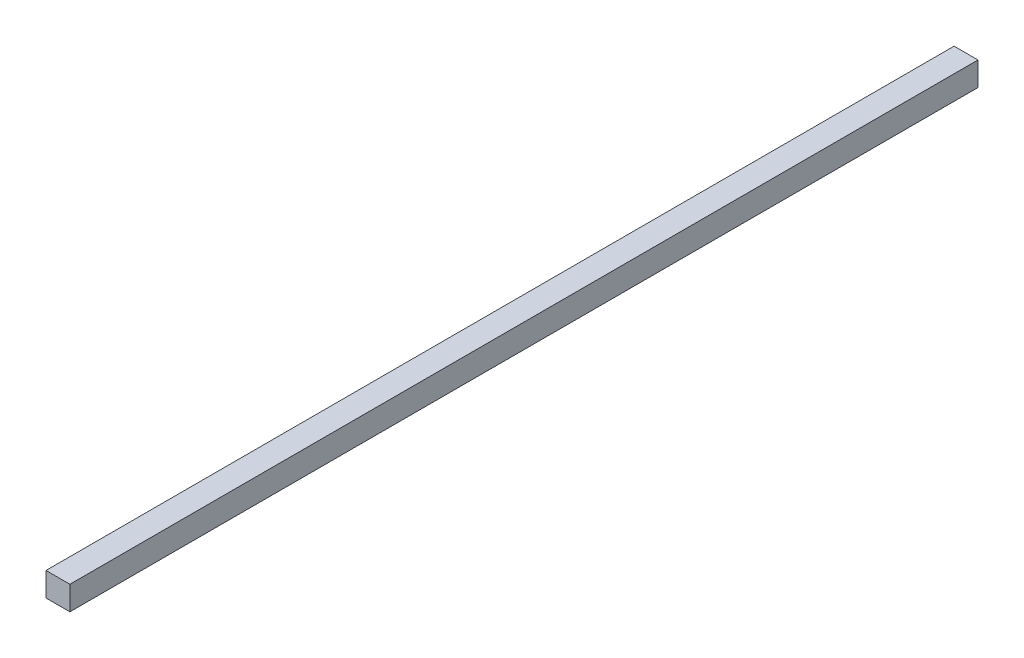
ISO-10303-21;
HEADER;
FILE_DESCRIPTION(('STEP AP214'),'2;1');
FILE_NAME('part.step','',(''),(''),'','','');
FILE_SCHEMA(('AUTOMOTIVE_DESIGN { 1 0 10303 214 1 1 1 1 }'));
ENDSEC;
DATA;
#1=APPLICATION_CONTEXT('core data for automotive mechanical design processes');
#2=APPLICATION_PROTOCOL_DEFINITION('international standard','automotive_design',2000,#1);
#3=PRODUCT_CONTEXT('',#1,'mechanical');
#4=PRODUCT('Part','Part','',(#3));
#5=PRODUCT_RELATED_PRODUCT_CATEGORY('part','',(#4));
#6=PRODUCT_DEFINITION_FORMATION('','',#4);
#7=PRODUCT_DEFINITION_CONTEXT('part definition',#1,'design');
#8=PRODUCT_DEFINITION('design','',#6,#7);
#9=PRODUCT_DEFINITION_SHAPE('','',#8);
#10=(LENGTH_UNIT() NAMED_UNIT(*) SI_UNIT(.MILLI.,.METRE.));
#11=(NAMED_UNIT(*) PLANE_ANGLE_UNIT() SI_UNIT($,.RADIAN.));
#12=(NAMED_UNIT(*) SI_UNIT($,.STERADIAN.) SOLID_ANGLE_UNIT());
#13=UNCERTAINTY_MEASURE_WITH_UNIT(LENGTH_MEASURE(1.E-05),#10,'distance_accuracy_value','');
#14=(GEOMETRIC_REPRESENTATION_CONTEXT(3) GLOBAL_UNCERTAINTY_ASSIGNED_CONTEXT((#13)) GLOBAL_UNIT_ASSIGNED_CONTEXT((#10,
#11,#12)) REPRESENTATION_CONTEXT('',''));
#15=CARTESIAN_POINT('',(0.,0.,0.));
#16=DIRECTION('',(0.,0.,1.));
#17=DIRECTION('',(1.,0.,0.));
#18=AXIS2_PLACEMENT_3D('',#15,#16,#17);
#19=CARTESIAN_POINT('',(-0.2499995,0.25000204,0.));
#20=DIRECTION('',(0.,1.,0.));
#21=DIRECTION('',(0.,0.,1.));
#22=AXIS2_PLACEMENT_3D('',#19,#20,#21);
#23=PLANE('',#22);
#24=DIRECTION('',(0.,0.,-1.));
#25=VECTOR('',#24,1.);
#26=CARTESIAN_POINT('',(0.25000204,0.25000204,0.));
#27=LINE('',#26,#25);
#28=CARTESIAN_POINT('',(0.25000204,0.25000204,0.));
#29=VERTEX_POINT('',#28);
#30=CARTESIAN_POINT('',(0.25000204,0.25000204,19.0000001));
#31=VERTEX_POINT('',#30);
#32=EDGE_CURVE('E61',#29,#31,#27,.F.);
#33=ORIENTED_EDGE('',*,*,#32,.F.);
#34=DIRECTION('',(1.,0.,0.));
#35=VECTOR('',#34,1.);
#36=CARTESIAN_POINT('',(-0.2499995,0.25000204,0.));
#37=LINE('',#36,#35);
#38=CARTESIAN_POINT('',(-0.2499995,0.25000204,0.));
#39=VERTEX_POINT('',#38);
#40=EDGE_CURVE('E19',#29,#39,#37,.F.);
#41=ORIENTED_EDGE('',*,*,#40,.T.);
#42=DIRECTION('',(0.,0.,1.));
#43=VECTOR('',#42,1.);
#44=CARTESIAN_POINT('',(-0.2499995,0.25000204,0.));
#45=LINE('',#44,#43);
#46=CARTESIAN_POINT('',(-0.2499995,0.25000204,19.0000001));
#47=VERTEX_POINT('',#46);
#48=EDGE_CURVE('E68',#47,#39,#45,.F.);
#49=ORIENTED_EDGE('',*,*,#48,.F.);
#50=DIRECTION('',(1.,0.,0.));
#51=VECTOR('',#50,1.);
#52=CARTESIAN_POINT('',(0.25000204,0.25000204,19.0000001));
#53=LINE('',#52,#51);
#54=EDGE_CURVE('E55',#31,#47,#53,.F.);
#55=ORIENTED_EDGE('',*,*,#54,.F.);
#56=EDGE_LOOP('',(#33,#41,#49,#55));
#57=FACE_BOUND('',#56,.T.);
#58=ADVANCED_FACE('F16',(#57),#23,.T.);
#59=CARTESIAN_POINT('',(0.25000204,0.25000204,0.));
#60=DIRECTION('',(1.,0.,0.));
#61=DIRECTION('',(0.,0.,-1.));
#62=AXIS2_PLACEMENT_3D('',#59,#60,#61);
#63=PLANE('',#62);
#64=DIRECTION('',(0.,0.,-1.));
#65=VECTOR('',#64,1.);
#66=CARTESIAN_POINT('',(0.25000204,-0.2499995,0.));
#67=LINE('',#66,#65);
#68=CARTESIAN_POINT('',(0.25000204,-0.2499995,0.));
#69=VERTEX_POINT('',#68);
#70=CARTESIAN_POINT('',(0.25000204,-0.2499995,19.0000001));
#71=VERTEX_POINT('',#70);
#72=EDGE_CURVE('E82',#69,#71,#67,.F.);
#73=ORIENTED_EDGE('',*,*,#72,.F.);
#74=DIRECTION('',(0.,1.,0.));
#75=VECTOR('',#74,1.);
#76=CARTESIAN_POINT('',(0.25000204,-0.2499995,0.));
#77=LINE('',#76,#75);
#78=EDGE_CURVE('E66',#69,#29,#77,.T.);
#79=ORIENTED_EDGE('',*,*,#78,.T.);
#80=ORIENTED_EDGE('',*,*,#32,.T.);
#81=DIRECTION('',(0.,1.,0.));
#82=VECTOR('',#81,1.);
#83=CARTESIAN_POINT('',(0.25000204,-0.2499995,19.0000001));
#84=LINE('',#83,#82);
#85=EDGE_CURVE('E63',#71,#31,#84,.T.);
#86=ORIENTED_EDGE('',*,*,#85,.F.);
#87=EDGE_LOOP('',(#73,#79,#80,#86));
#88=FACE_BOUND('',#87,.T.);
#89=ADVANCED_FACE('F62',(#88),#63,.T.);
#90=CARTESIAN_POINT('',(0.25000204,-0.2499995,19.0000001));
#91=DIRECTION('',(0.,0.,1.));
#92=DIRECTION('',(1.,0.,0.));
#93=AXIS2_PLACEMENT_3D('',#90,#91,#92);
#94=PLANE('',#93);
#95=DIRECTION('',(0.,1.,0.));
#96=VECTOR('',#95,1.);
#97=CARTESIAN_POINT('',(-0.2499995,-0.2499995,19.0000001));
#98=LINE('',#97,#96);
#99=CARTESIAN_POINT('',(-0.2499995,-0.2499995,19.0000001));
#100=VERTEX_POINT('',#99);
#101=EDGE_CURVE('E70',#100,#47,#98,.T.);
#102=ORIENTED_EDGE('',*,*,#101,.F.);
#103=DIRECTION('',(1.,0.,0.));
#104=VECTOR('',#103,1.);
#105=CARTESIAN_POINT('',(0.25000204,-0.2499995,19.0000001));
#106=LINE('',#105,#104);
#107=EDGE_CURVE('E74',#71,#100,#106,.F.);
#108=ORIENTED_EDGE('',*,*,#107,.F.);
#109=ORIENTED_EDGE('',*,*,#85,.T.);
#110=ORIENTED_EDGE('',*,*,#54,.T.);
#111=EDGE_LOOP('',(#102,#108,#109,#110));
#112=FACE_BOUND('',#111,.T.);
#113=ADVANCED_FACE('F72',(#112),#94,.T.);
#114=CARTESIAN_POINT('',(-0.2499995,-0.2499995,0.));
#115=DIRECTION('',(-1.,0.,0.));
#116=DIRECTION('',(0.,0.,1.));
#117=AXIS2_PLACEMENT_3D('',#114,#115,#116);
#118=PLANE('',#117);
#119=ORIENTED_EDGE('',*,*,#48,.T.);
#120=DIRECTION('',(0.,1.,0.));
#121=VECTOR('',#120,1.);
#122=CARTESIAN_POINT('',(-0.2499995,-0.2499995,0.));
#123=LINE('',#122,#121);
#124=CARTESIAN_POINT('',(-0.2499995,-0.2499995,0.));
#125=VERTEX_POINT('',#124);
#126=EDGE_CURVE('E34',#39,#125,#123,.F.);
#127=ORIENTED_EDGE('',*,*,#126,.T.);
#128=DIRECTION('',(0.,0.,-1.));
#129=VECTOR('',#128,1.);
#130=CARTESIAN_POINT('',(-0.2499995,-0.2499995,0.));
#131=LINE('',#130,#129);
#132=EDGE_CURVE('E25',#100,#125,#131,.T.);
#133=ORIENTED_EDGE('',*,*,#132,.F.);
#134=ORIENTED_EDGE('',*,*,#101,.T.);
#135=EDGE_LOOP('',(#119,#127,#133,#134));
#136=FACE_BOUND('',#135,.T.);
#137=ADVANCED_FACE('F88',(#136),#118,.T.);
#138=CARTESIAN_POINT('',(0.25000204,-0.2499995,0.));
#139=DIRECTION('',(0.,0.,1.));
#140=DIRECTION('',(1.,0.,0.));
#141=AXIS2_PLACEMENT_3D('',#138,#139,#140);
#142=PLANE('',#141);
#143=ORIENTED_EDGE('',*,*,#126,.F.);
#144=ORIENTED_EDGE('',*,*,#40,.F.);
#145=ORIENTED_EDGE('',*,*,#78,.F.);
#146=DIRECTION('',(1.,0.,0.));
#147=VECTOR('',#146,1.);
#148=CARTESIAN_POINT('',(0.25000204,-0.2499995,0.));
#149=LINE('',#148,#147);
#150=EDGE_CURVE('E11',#125,#69,#149,.T.);
#151=ORIENTED_EDGE('',*,*,#150,.F.);
#152=EDGE_LOOP('',(#143,#144,#145,#151));
#153=FACE_BOUND('',#152,.T.);
#154=ADVANCED_FACE('F90',(#153),#142,.F.);
#155=CARTESIAN_POINT('',(0.25000204,-0.2499995,0.));
#156=DIRECTION('',(0.,-1.,0.));
#157=DIRECTION('',(0.,0.,-1.));
#158=AXIS2_PLACEMENT_3D('',#155,#156,#157);
#159=PLANE('',#158);
#160=ORIENTED_EDGE('',*,*,#132,.T.);
#161=ORIENTED_EDGE('',*,*,#150,.T.);
#162=ORIENTED_EDGE('',*,*,#72,.T.);
#163=ORIENTED_EDGE('',*,*,#107,.T.);
#164=EDGE_LOOP('',(#160,#161,#162,#163));
#165=FACE_BOUND('',#164,.T.);
#166=ADVANCED_FACE('F87',(#165),#159,.T.);
#167=CLOSED_SHELL('',(#58,#89,#113,#137,#154,#166));
#168=MANIFOLD_SOLID_BREP('B1',#167);
#169=ADVANCED_BREP_SHAPE_REPRESENTATION('',(#18,#168),#14);
#170=SHAPE_DEFINITION_REPRESENTATION(#9,#169);
ENDSEC;
END-ISO-10303-21;
